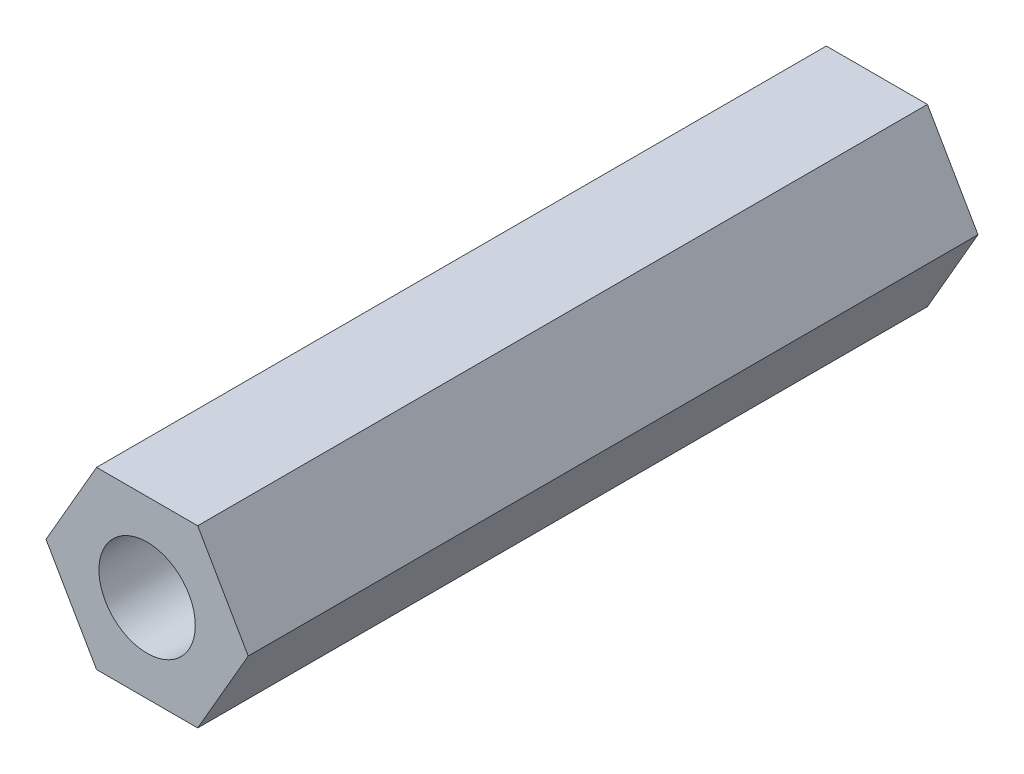
ISO-10303-21;
HEADER;
FILE_DESCRIPTION(('STEP AP214'),'2;1');
FILE_NAME('part.step','',(''),(''),'','','');
FILE_SCHEMA(('AUTOMOTIVE_DESIGN { 1 0 10303 214 1 1 1 1 }'));
ENDSEC;
DATA;
#1=APPLICATION_CONTEXT('core data for automotive mechanical design processes');
#2=APPLICATION_PROTOCOL_DEFINITION('international standard','automotive_design',2000,#1);
#3=PRODUCT_CONTEXT('',#1,'mechanical');
#4=PRODUCT('Part','Part','',(#3));
#5=PRODUCT_RELATED_PRODUCT_CATEGORY('part','',(#4));
#6=PRODUCT_DEFINITION_FORMATION('','',#4);
#7=PRODUCT_DEFINITION_CONTEXT('part definition',#1,'design');
#8=PRODUCT_DEFINITION('design','',#6,#7);
#9=PRODUCT_DEFINITION_SHAPE('','',#8);
#10=(LENGTH_UNIT() NAMED_UNIT(*) SI_UNIT(.MILLI.,.METRE.));
#11=(NAMED_UNIT(*) PLANE_ANGLE_UNIT() SI_UNIT($,.RADIAN.));
#12=(NAMED_UNIT(*) SI_UNIT($,.STERADIAN.) SOLID_ANGLE_UNIT());
#13=UNCERTAINTY_MEASURE_WITH_UNIT(LENGTH_MEASURE(1.E-05),#10,'distance_accuracy_value','');
#14=(GEOMETRIC_REPRESENTATION_CONTEXT(3) GLOBAL_UNCERTAINTY_ASSIGNED_CONTEXT((#13)) GLOBAL_UNIT_ASSIGNED_CONTEXT((#10,
#11,#12)) REPRESENTATION_CONTEXT('',''));
#15=CARTESIAN_POINT('',(0.,0.,0.));
#16=DIRECTION('',(0.,0.,1.));
#17=DIRECTION('',(1.,0.,0.));
#18=AXIS2_PLACEMENT_3D('',#15,#16,#17);
#19=CARTESIAN_POINT('',(0.,0.,25.));
#20=DIRECTION('',(0.,0.,1.));
#21=DIRECTION('',(1.,0.,0.));
#22=AXIS2_PLACEMENT_3D('',#19,#20,#21);
#23=PLANE('',#22);
#24=DIRECTION('',(-0.5,0.866025403784439,0.));
#25=VECTOR('',#24,1.);
#26=CARTESIAN_POINT('',(3.46410161513776,0.,25.));
#27=LINE('',#26,#25);
#28=CARTESIAN_POINT('',(3.46410161513776,0.,25.));
#29=VERTEX_POINT('',#28);
#30=CARTESIAN_POINT('',(1.73205080756888,3.,25.));
#31=VERTEX_POINT('',#30);
#32=EDGE_CURVE('E146',#29,#31,#27,.T.);
#33=ORIENTED_EDGE('',*,*,#32,.T.);
#34=DIRECTION('',(-1.,0.,0.));
#35=VECTOR('',#34,1.);
#36=CARTESIAN_POINT('',(1.73205080756888,3.,25.));
#37=LINE('',#36,#35);
#38=CARTESIAN_POINT('',(-1.73205080756888,3.,25.));
#39=VERTEX_POINT('',#38);
#40=EDGE_CURVE('E94',#31,#39,#37,.T.);
#41=ORIENTED_EDGE('',*,*,#40,.T.);
#42=DIRECTION('',(-0.5,-0.866025403784439,0.));
#43=VECTOR('',#42,1.);
#44=CARTESIAN_POINT('',(-1.73205080756888,3.,25.));
#45=LINE('',#44,#43);
#46=CARTESIAN_POINT('',(-3.46410161513775,0.,25.));
#47=VERTEX_POINT('',#46);
#48=EDGE_CURVE('E107',#39,#47,#45,.T.);
#49=ORIENTED_EDGE('',*,*,#48,.T.);
#50=DIRECTION('',(0.5,-0.866025403784439,0.));
#51=VECTOR('',#50,1.);
#52=CARTESIAN_POINT('',(-3.46410161513775,0.,25.));
#53=LINE('',#52,#51);
#54=CARTESIAN_POINT('',(-1.73205080756888,-3.,25.));
#55=VERTEX_POINT('',#54);
#56=EDGE_CURVE('E101',#47,#55,#53,.T.);
#57=ORIENTED_EDGE('',*,*,#56,.T.);
#58=DIRECTION('',(1.,0.,0.));
#59=VECTOR('',#58,1.);
#60=CARTESIAN_POINT('',(-1.73205080756888,-3.,25.));
#61=LINE('',#60,#59);
#62=CARTESIAN_POINT('',(1.73205080756888,-3.,25.));
#63=VERTEX_POINT('',#62);
#64=EDGE_CURVE('E105',#55,#63,#61,.T.);
#65=ORIENTED_EDGE('',*,*,#64,.T.);
#66=DIRECTION('',(0.5,0.866025403784438,0.));
#67=VECTOR('',#66,1.);
#68=CARTESIAN_POINT('',(1.73205080756888,-3.,25.));
#69=LINE('',#68,#67);
#70=EDGE_CURVE('E57',#63,#29,#69,.T.);
#71=ORIENTED_EDGE('',*,*,#70,.T.);
#72=EDGE_LOOP('',(#33,#41,#49,#57,#65,#71));
#73=FACE_BOUND('',#72,.T.);
#74=CARTESIAN_POINT('',(0.,0.,25.));
#75=DIRECTION('',(0.,0.,1.));
#76=DIRECTION('',(1.,0.,0.));
#77=AXIS2_PLACEMENT_3D('',#74,#75,#76);
#78=CIRCLE('',#77,1.65);
#79=CARTESIAN_POINT('',(1.65,0.,25.));
#80=VERTEX_POINT('',#79);
#81=EDGE_CURVE('E134',#80,#80,#78,.T.);
#82=ORIENTED_EDGE('',*,*,#81,.F.);
#83=EDGE_LOOP('',(#82));
#84=FACE_BOUND('',#83,.T.);
#85=ADVANCED_FACE('F39',(#73,#84),#23,.T.);
#86=CARTESIAN_POINT('',(0.,0.,0.));
#87=DIRECTION('',(0.,0.,1.));
#88=DIRECTION('',(1.,0.,0.));
#89=AXIS2_PLACEMENT_3D('',#86,#87,#88);
#90=PLANE('',#89);
#91=DIRECTION('',(-0.5,0.866025403784439,0.));
#92=VECTOR('',#91,1.);
#93=CARTESIAN_POINT('',(3.46410161513776,0.,0.));
#94=LINE('',#93,#92);
#95=CARTESIAN_POINT('',(3.46410161513776,0.,0.));
#96=VERTEX_POINT('',#95);
#97=CARTESIAN_POINT('',(1.73205080756888,3.,0.));
#98=VERTEX_POINT('',#97);
#99=EDGE_CURVE('E129',#96,#98,#94,.T.);
#100=ORIENTED_EDGE('',*,*,#99,.F.);
#101=DIRECTION('',(0.5,0.866025403784438,0.));
#102=VECTOR('',#101,1.);
#103=CARTESIAN_POINT('',(1.73205080756888,-3.,0.));
#104=LINE('',#103,#102);
#105=CARTESIAN_POINT('',(1.73205080756888,-3.,0.));
#106=VERTEX_POINT('',#105);
#107=EDGE_CURVE('E86',#106,#96,#104,.T.);
#108=ORIENTED_EDGE('',*,*,#107,.F.);
#109=DIRECTION('',(1.,0.,0.));
#110=VECTOR('',#109,1.);
#111=CARTESIAN_POINT('',(-1.73205080756888,-3.,0.));
#112=LINE('',#111,#110);
#113=CARTESIAN_POINT('',(-1.73205080756888,-3.,0.));
#114=VERTEX_POINT('',#113);
#115=EDGE_CURVE('E80',#114,#106,#112,.T.);
#116=ORIENTED_EDGE('',*,*,#115,.F.);
#117=DIRECTION('',(0.5,-0.866025403784439,0.));
#118=VECTOR('',#117,1.);
#119=CARTESIAN_POINT('',(-3.46410161513775,0.,0.));
#120=LINE('',#119,#118);
#121=CARTESIAN_POINT('',(-3.46410161513775,0.,0.));
#122=VERTEX_POINT('',#121);
#123=EDGE_CURVE('E116',#122,#114,#120,.T.);
#124=ORIENTED_EDGE('',*,*,#123,.F.);
#125=DIRECTION('',(-0.5,-0.866025403784439,0.));
#126=VECTOR('',#125,1.);
#127=CARTESIAN_POINT('',(-1.73205080756888,3.,0.));
#128=LINE('',#127,#126);
#129=CARTESIAN_POINT('',(-1.73205080756888,3.,0.));
#130=VERTEX_POINT('',#129);
#131=EDGE_CURVE('E137',#130,#122,#128,.T.);
#132=ORIENTED_EDGE('',*,*,#131,.F.);
#133=DIRECTION('',(-1.,0.,0.));
#134=VECTOR('',#133,1.);
#135=CARTESIAN_POINT('',(1.73205080756888,3.,0.));
#136=LINE('',#135,#134);
#137=EDGE_CURVE('E133',#98,#130,#136,.T.);
#138=ORIENTED_EDGE('',*,*,#137,.F.);
#139=EDGE_LOOP('',(#100,#108,#116,#124,#132,#138));
#140=FACE_BOUND('',#139,.T.);
#141=CARTESIAN_POINT('',(0.,0.,0.));
#142=DIRECTION('',(0.,0.,1.));
#143=DIRECTION('',(1.,0.,0.));
#144=AXIS2_PLACEMENT_3D('',#141,#142,#143);
#145=CIRCLE('',#144,1.65);
#146=CARTESIAN_POINT('',(1.65,0.,0.));
#147=VERTEX_POINT('',#146);
#148=EDGE_CURVE('E243',#147,#147,#145,.T.);
#149=ORIENTED_EDGE('',*,*,#148,.T.);
#150=EDGE_LOOP('',(#149));
#151=FACE_BOUND('',#150,.T.);
#152=ADVANCED_FACE('F159',(#140,#151),#90,.F.);
#153=CARTESIAN_POINT('',(3.46410161513776,0.,25.));
#154=DIRECTION('',(-0.866025403784439,-0.5,0.));
#155=DIRECTION('',(0.5,-0.866025403784439,0.));
#156=AXIS2_PLACEMENT_3D('',#153,#154,#155);
#157=PLANE('',#156);
#158=ORIENTED_EDGE('',*,*,#99,.T.);
#159=DIRECTION('',(0.,0.,-1.));
#160=VECTOR('',#159,1.);
#161=CARTESIAN_POINT('',(1.73205080756888,3.,25.));
#162=LINE('',#161,#160);
#163=EDGE_CURVE('E11',#31,#98,#162,.T.);
#164=ORIENTED_EDGE('',*,*,#163,.F.);
#165=ORIENTED_EDGE('',*,*,#32,.F.);
#166=DIRECTION('',(0.,0.,-1.));
#167=VECTOR('',#166,1.);
#168=CARTESIAN_POINT('',(3.46410161513776,0.,25.));
#169=LINE('',#168,#167);
#170=EDGE_CURVE('E125',#29,#96,#169,.T.);
#171=ORIENTED_EDGE('',*,*,#170,.T.);
#172=EDGE_LOOP('',(#158,#164,#165,#171));
#173=FACE_BOUND('',#172,.T.);
#174=ADVANCED_FACE('F41',(#173),#157,.F.);
#175=CARTESIAN_POINT('',(1.73205080756888,3.,25.));
#176=DIRECTION('',(0.,-1.,0.));
#177=DIRECTION('',(1.,0.,0.));
#178=AXIS2_PLACEMENT_3D('',#175,#176,#177);
#179=PLANE('',#178);
#180=ORIENTED_EDGE('',*,*,#137,.T.);
#181=DIRECTION('',(0.,0.,-1.));
#182=VECTOR('',#181,1.);
#183=CARTESIAN_POINT('',(-1.73205080756888,3.,25.));
#184=LINE('',#183,#182);
#185=EDGE_CURVE('E49',#39,#130,#184,.T.);
#186=ORIENTED_EDGE('',*,*,#185,.F.);
#187=ORIENTED_EDGE('',*,*,#40,.F.);
#188=ORIENTED_EDGE('',*,*,#163,.T.);
#189=EDGE_LOOP('',(#180,#186,#187,#188));
#190=FACE_BOUND('',#189,.T.);
#191=ADVANCED_FACE('F184',(#190),#179,.F.);
#192=CARTESIAN_POINT('',(-1.73205080756888,3.,25.));
#193=DIRECTION('',(0.866025403784439,-0.5,0.));
#194=DIRECTION('',(0.5,0.866025403784439,0.));
#195=AXIS2_PLACEMENT_3D('',#192,#193,#194);
#196=PLANE('',#195);
#197=ORIENTED_EDGE('',*,*,#131,.T.);
#198=DIRECTION('',(0.,0.,-1.));
#199=VECTOR('',#198,1.);
#200=CARTESIAN_POINT('',(-3.46410161513775,0.,25.));
#201=LINE('',#200,#199);
#202=EDGE_CURVE('E118',#47,#122,#201,.T.);
#203=ORIENTED_EDGE('',*,*,#202,.F.);
#204=ORIENTED_EDGE('',*,*,#48,.F.);
#205=ORIENTED_EDGE('',*,*,#185,.T.);
#206=EDGE_LOOP('',(#197,#203,#204,#205));
#207=FACE_BOUND('',#206,.T.);
#208=ADVANCED_FACE('F156',(#207),#196,.F.);
#209=CARTESIAN_POINT('',(-3.46410161513775,0.,25.));
#210=DIRECTION('',(0.866025403784439,0.5,0.));
#211=DIRECTION('',(-0.5,0.866025403784439,0.));
#212=AXIS2_PLACEMENT_3D('',#209,#210,#211);
#213=PLANE('',#212);
#214=ORIENTED_EDGE('',*,*,#123,.T.);
#215=DIRECTION('',(0.,0.,-1.));
#216=VECTOR('',#215,1.);
#217=CARTESIAN_POINT('',(-1.73205080756888,-3.,25.));
#218=LINE('',#217,#216);
#219=EDGE_CURVE('E113',#55,#114,#218,.T.);
#220=ORIENTED_EDGE('',*,*,#219,.F.);
#221=ORIENTED_EDGE('',*,*,#56,.F.);
#222=ORIENTED_EDGE('',*,*,#202,.T.);
#223=EDGE_LOOP('',(#214,#220,#221,#222));
#224=FACE_BOUND('',#223,.T.);
#225=ADVANCED_FACE('F114',(#224),#213,.F.);
#226=CARTESIAN_POINT('',(-1.73205080756888,-3.,25.));
#227=DIRECTION('',(0.,1.,0.));
#228=DIRECTION('',(-1.,0.,0.));
#229=AXIS2_PLACEMENT_3D('',#226,#227,#228);
#230=PLANE('',#229);
#231=ORIENTED_EDGE('',*,*,#115,.T.);
#232=DIRECTION('',(0.,0.,-1.));
#233=VECTOR('',#232,1.);
#234=CARTESIAN_POINT('',(1.73205080756888,-3.,25.));
#235=LINE('',#234,#233);
#236=EDGE_CURVE('E119',#63,#106,#235,.T.);
#237=ORIENTED_EDGE('',*,*,#236,.F.);
#238=ORIENTED_EDGE('',*,*,#64,.F.);
#239=ORIENTED_EDGE('',*,*,#219,.T.);
#240=EDGE_LOOP('',(#231,#237,#238,#239));
#241=FACE_BOUND('',#240,.T.);
#242=ADVANCED_FACE('F121',(#241),#230,.F.);
#243=CARTESIAN_POINT('',(1.73205080756888,-3.,25.));
#244=DIRECTION('',(-0.866025403784438,0.5,0.));
#245=DIRECTION('',(-0.5,-0.866025403784439,0.));
#246=AXIS2_PLACEMENT_3D('',#243,#244,#245);
#247=PLANE('',#246);
#248=ORIENTED_EDGE('',*,*,#107,.T.);
#249=ORIENTED_EDGE('',*,*,#170,.F.);
#250=ORIENTED_EDGE('',*,*,#70,.F.);
#251=ORIENTED_EDGE('',*,*,#236,.T.);
#252=EDGE_LOOP('',(#248,#249,#250,#251));
#253=FACE_BOUND('',#252,.T.);
#254=ADVANCED_FACE('F164',(#253),#247,.F.);
#255=CARTESIAN_POINT('',(0.,0.,25.));
#256=DIRECTION('',(0.,0.,-1.));
#257=DIRECTION('',(-1.,0.,0.));
#258=AXIS2_PLACEMENT_3D('',#255,#256,#257);
#259=CYLINDRICAL_SURFACE('',#258,1.65);
#260=ORIENTED_EDGE('',*,*,#81,.T.);
#261=EDGE_LOOP('',(#260));
#262=FACE_BOUND('',#261,.T.);
#263=ORIENTED_EDGE('',*,*,#148,.F.);
#264=EDGE_LOOP('',(#263));
#265=FACE_BOUND('',#264,.T.);
#266=ADVANCED_FACE('F166',(#262,#265),#259,.F.);
#267=CLOSED_SHELL('',(#85,#152,#174,#191,#208,#225,#242,#254,#266));
#268=MANIFOLD_SOLID_BREP('B2',#267);
#269=ADVANCED_BREP_SHAPE_REPRESENTATION('',(#18,#268),#14);
#270=SHAPE_DEFINITION_REPRESENTATION(#9,#269);
ENDSEC;
END-ISO-10303-21;
